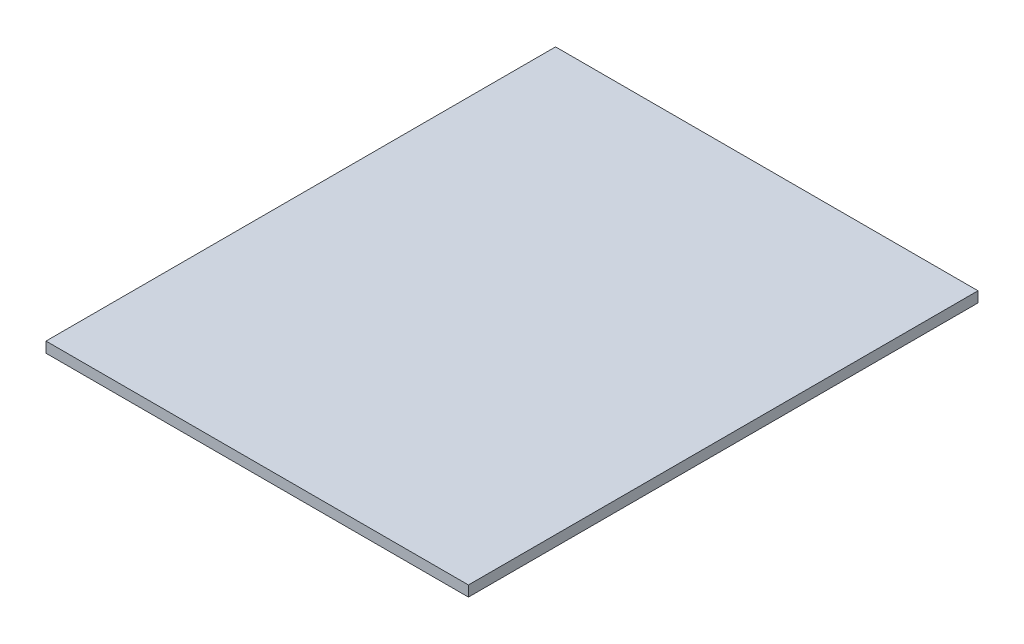
ISO-10303-21;
HEADER;
FILE_DESCRIPTION(('STEP AP214'),'2;1');
FILE_NAME('part.step','',(''),(''),'','','');
FILE_SCHEMA(('AUTOMOTIVE_DESIGN { 1 0 10303 214 1 1 1 1 }'));
ENDSEC;
DATA;
#1=APPLICATION_CONTEXT('core data for automotive mechanical design processes');
#2=APPLICATION_PROTOCOL_DEFINITION('international standard','automotive_design',2000,#1);
#3=PRODUCT_CONTEXT('',#1,'mechanical');
#4=PRODUCT('Part','Part','',(#3));
#5=PRODUCT_RELATED_PRODUCT_CATEGORY('part','',(#4));
#6=PRODUCT_DEFINITION_FORMATION('','',#4);
#7=PRODUCT_DEFINITION_CONTEXT('part definition',#1,'design');
#8=PRODUCT_DEFINITION('design','',#6,#7);
#9=PRODUCT_DEFINITION_SHAPE('','',#8);
#10=(LENGTH_UNIT() NAMED_UNIT(*) SI_UNIT(.MILLI.,.METRE.));
#11=(NAMED_UNIT(*) PLANE_ANGLE_UNIT() SI_UNIT($,.RADIAN.));
#12=(NAMED_UNIT(*) SI_UNIT($,.STERADIAN.) SOLID_ANGLE_UNIT());
#13=UNCERTAINTY_MEASURE_WITH_UNIT(LENGTH_MEASURE(1.E-05),#10,'distance_accuracy_value','');
#14=(GEOMETRIC_REPRESENTATION_CONTEXT(3) GLOBAL_UNCERTAINTY_ASSIGNED_CONTEXT((#13)) GLOBAL_UNIT_ASSIGNED_CONTEXT((#10,
#11,#12)) REPRESENTATION_CONTEXT('',''));
#15=CARTESIAN_POINT('',(0.,0.,0.));
#16=DIRECTION('',(0.,0.,1.));
#17=DIRECTION('',(1.,0.,0.));
#18=AXIS2_PLACEMENT_3D('',#15,#16,#17);
#19=CARTESIAN_POINT('',(0.,20.,0.));
#20=DIRECTION('',(1.,0.,0.));
#21=DIRECTION('',(0.,0.,-1.));
#22=AXIS2_PLACEMENT_3D('',#19,#20,#21);
#23=PLANE('',#22);
#24=DIRECTION('',(0.,0.,1.));
#25=VECTOR('',#24,1.);
#26=CARTESIAN_POINT('',(0.,0.,0.));
#27=LINE('',#26,#25);
#28=CARTESIAN_POINT('',(0.,0.,-965.));
#29=VERTEX_POINT('',#28);
#30=CARTESIAN_POINT('',(0.,0.,0.));
#31=VERTEX_POINT('',#30);
#32=EDGE_CURVE('E104',#29,#31,#27,.T.);
#33=ORIENTED_EDGE('',*,*,#32,.T.);
#34=DIRECTION('',(0.,-1.,0.));
#35=VECTOR('',#34,1.);
#36=CARTESIAN_POINT('',(0.,20.,0.));
#37=LINE('',#36,#35);
#38=CARTESIAN_POINT('',(0.,20.,0.));
#39=VERTEX_POINT('',#38);
#40=EDGE_CURVE('E11',#39,#31,#37,.T.);
#41=ORIENTED_EDGE('',*,*,#40,.F.);
#42=DIRECTION('',(0.,0.,1.));
#43=VECTOR('',#42,1.);
#44=CARTESIAN_POINT('',(0.,20.,0.));
#45=LINE('',#44,#43);
#46=CARTESIAN_POINT('',(0.,20.,-965.));
#47=VERTEX_POINT('',#46);
#48=EDGE_CURVE('E92',#47,#39,#45,.T.);
#49=ORIENTED_EDGE('',*,*,#48,.F.);
#50=DIRECTION('',(0.,-1.,0.));
#51=VECTOR('',#50,1.);
#52=CARTESIAN_POINT('',(0.,20.,-965.));
#53=LINE('',#52,#51);
#54=EDGE_CURVE('E100',#47,#29,#53,.T.);
#55=ORIENTED_EDGE('',*,*,#54,.T.);
#56=EDGE_LOOP('',(#33,#41,#49,#55));
#57=FACE_BOUND('',#56,.T.);
#58=ADVANCED_FACE('F41',(#57),#23,.F.);
#59=CARTESIAN_POINT('',(0.,20.,0.));
#60=DIRECTION('',(0.,0.,-1.));
#61=DIRECTION('',(-1.,0.,0.));
#62=AXIS2_PLACEMENT_3D('',#59,#60,#61);
#63=PLANE('',#62);
#64=DIRECTION('',(1.,0.,0.));
#65=VECTOR('',#64,1.);
#66=CARTESIAN_POINT('',(0.,0.,0.));
#67=LINE('',#66,#65);
#68=CARTESIAN_POINT('',(800.,0.,0.));
#69=VERTEX_POINT('',#68);
#70=EDGE_CURVE('E96',#31,#69,#67,.T.);
#71=ORIENTED_EDGE('',*,*,#70,.T.);
#72=DIRECTION('',(0.,-1.,0.));
#73=VECTOR('',#72,1.);
#74=CARTESIAN_POINT('',(800.,20.,0.));
#75=LINE('',#74,#73);
#76=CARTESIAN_POINT('',(800.,20.,0.));
#77=VERTEX_POINT('',#76);
#78=EDGE_CURVE('E49',#77,#69,#75,.T.);
#79=ORIENTED_EDGE('',*,*,#78,.F.);
#80=DIRECTION('',(1.,0.,0.));
#81=VECTOR('',#80,1.);
#82=CARTESIAN_POINT('',(0.,20.,0.));
#83=LINE('',#82,#81);
#84=EDGE_CURVE('E87',#39,#77,#83,.T.);
#85=ORIENTED_EDGE('',*,*,#84,.F.);
#86=ORIENTED_EDGE('',*,*,#40,.T.);
#87=EDGE_LOOP('',(#71,#79,#85,#86));
#88=FACE_BOUND('',#87,.T.);
#89=ADVANCED_FACE('F95',(#88),#63,.F.);
#90=CARTESIAN_POINT('',(800.,20.,0.));
#91=DIRECTION('',(-1.,0.,0.));
#92=DIRECTION('',(0.,0.,1.));
#93=AXIS2_PLACEMENT_3D('',#90,#91,#92);
#94=PLANE('',#93);
#95=DIRECTION('',(0.,0.,-1.));
#96=VECTOR('',#95,1.);
#97=CARTESIAN_POINT('',(800.,0.,0.));
#98=LINE('',#97,#96);
#99=CARTESIAN_POINT('',(800.,0.,-965.));
#100=VERTEX_POINT('',#99);
#101=EDGE_CURVE('E74',#69,#100,#98,.T.);
#102=ORIENTED_EDGE('',*,*,#101,.T.);
#103=DIRECTION('',(0.,-1.,0.));
#104=VECTOR('',#103,1.);
#105=CARTESIAN_POINT('',(800.,20.,-965.));
#106=LINE('',#105,#104);
#107=CARTESIAN_POINT('',(800.,20.,-965.));
#108=VERTEX_POINT('',#107);
#109=EDGE_CURVE('E97',#108,#100,#106,.T.);
#110=ORIENTED_EDGE('',*,*,#109,.F.);
#111=DIRECTION('',(0.,0.,-1.));
#112=VECTOR('',#111,1.);
#113=CARTESIAN_POINT('',(800.,20.,0.));
#114=LINE('',#113,#112);
#115=EDGE_CURVE('E90',#77,#108,#114,.T.);
#116=ORIENTED_EDGE('',*,*,#115,.F.);
#117=ORIENTED_EDGE('',*,*,#78,.T.);
#118=EDGE_LOOP('',(#102,#110,#116,#117));
#119=FACE_BOUND('',#118,.T.);
#120=ADVANCED_FACE('F98',(#119),#94,.F.);
#121=CARTESIAN_POINT('',(0.,20.,-965.));
#122=DIRECTION('',(0.,0.,1.));
#123=DIRECTION('',(1.,0.,0.));
#124=AXIS2_PLACEMENT_3D('',#121,#122,#123);
#125=PLANE('',#124);
#126=DIRECTION('',(-1.,0.,0.));
#127=VECTOR('',#126,1.);
#128=CARTESIAN_POINT('',(0.,0.,-965.));
#129=LINE('',#128,#127);
#130=EDGE_CURVE('E80',#100,#29,#129,.T.);
#131=ORIENTED_EDGE('',*,*,#130,.T.);
#132=ORIENTED_EDGE('',*,*,#54,.F.);
#133=DIRECTION('',(-1.,0.,0.));
#134=VECTOR('',#133,1.);
#135=CARTESIAN_POINT('',(0.,20.,-965.));
#136=LINE('',#135,#134);
#137=EDGE_CURVE('E57',#108,#47,#136,.T.);
#138=ORIENTED_EDGE('',*,*,#137,.F.);
#139=ORIENTED_EDGE('',*,*,#109,.T.);
#140=EDGE_LOOP('',(#131,#132,#138,#139));
#141=FACE_BOUND('',#140,.T.);
#142=ADVANCED_FACE('F111',(#141),#125,.F.);
#143=CARTESIAN_POINT('',(0.,20.,0.));
#144=DIRECTION('',(0.,-1.,0.));
#145=DIRECTION('',(0.,0.,-1.));
#146=AXIS2_PLACEMENT_3D('',#143,#144,#145);
#147=PLANE('',#146);
#148=ORIENTED_EDGE('',*,*,#48,.T.);
#149=ORIENTED_EDGE('',*,*,#84,.T.);
#150=ORIENTED_EDGE('',*,*,#115,.T.);
#151=ORIENTED_EDGE('',*,*,#137,.T.);
#152=EDGE_LOOP('',(#148,#149,#150,#151));
#153=FACE_BOUND('',#152,.T.);
#154=ADVANCED_FACE('F88',(#153),#147,.F.);
#155=CARTESIAN_POINT('',(0.,0.,0.));
#156=DIRECTION('',(0.,-1.,0.));
#157=DIRECTION('',(0.,0.,-1.));
#158=AXIS2_PLACEMENT_3D('',#155,#156,#157);
#159=PLANE('',#158);
#160=ORIENTED_EDGE('',*,*,#32,.F.);
#161=ORIENTED_EDGE('',*,*,#130,.F.);
#162=ORIENTED_EDGE('',*,*,#101,.F.);
#163=ORIENTED_EDGE('',*,*,#70,.F.);
#164=EDGE_LOOP('',(#160,#161,#162,#163));
#165=FACE_BOUND('',#164,.T.);
#166=ADVANCED_FACE('F114',(#165),#159,.T.);
#167=CLOSED_SHELL('',(#58,#89,#120,#142,#154,#166));
#168=MANIFOLD_SOLID_BREP('B2',#167);
#169=ADVANCED_BREP_SHAPE_REPRESENTATION('',(#18,#168),#14);
#170=SHAPE_DEFINITION_REPRESENTATION(#9,#169);
ENDSEC;
END-ISO-10303-21;
